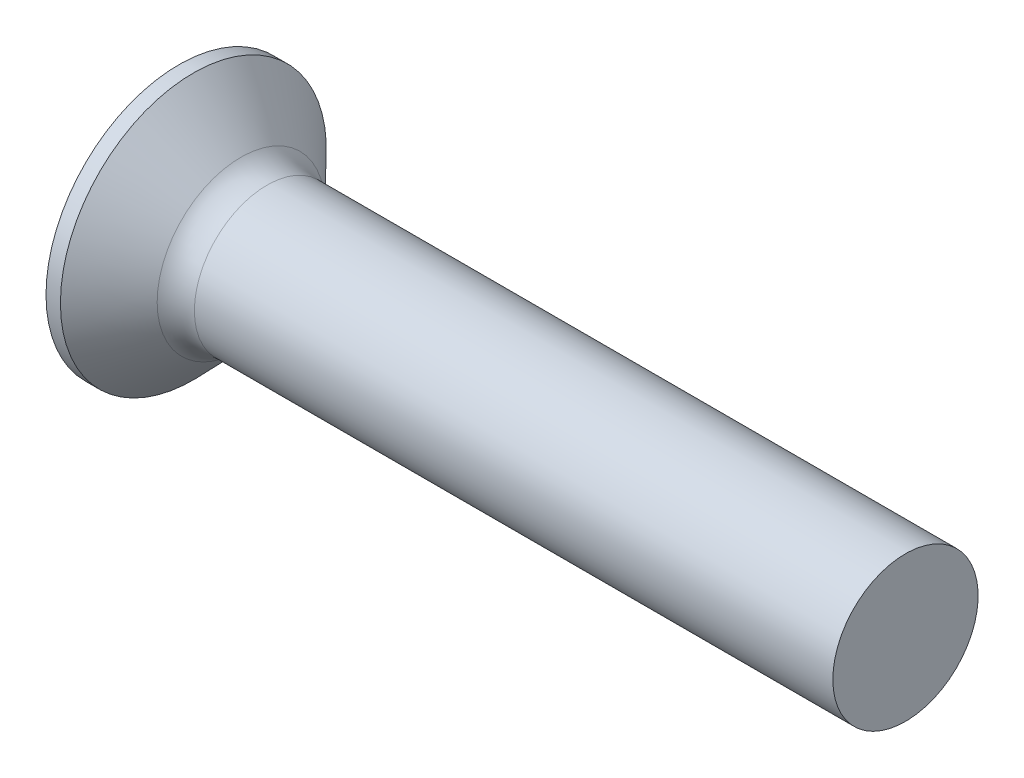
ISO-10303-21;
HEADER;
FILE_DESCRIPTION(('STEP AP214'),'2;1');
FILE_NAME('part.step','',(''),(''),'','','');
FILE_SCHEMA(('AUTOMOTIVE_DESIGN { 1 0 10303 214 1 1 1 1 }'));
ENDSEC;
DATA;
#1=APPLICATION_CONTEXT('core data for automotive mechanical design processes');
#2=APPLICATION_PROTOCOL_DEFINITION('international standard','automotive_design',2000,#1);
#3=PRODUCT_CONTEXT('',#1,'mechanical');
#4=PRODUCT('Part','Part','',(#3));
#5=PRODUCT_RELATED_PRODUCT_CATEGORY('part','',(#4));
#6=PRODUCT_DEFINITION_FORMATION('','',#4);
#7=PRODUCT_DEFINITION_CONTEXT('part definition',#1,'design');
#8=PRODUCT_DEFINITION('design','',#6,#7);
#9=PRODUCT_DEFINITION_SHAPE('','',#8);
#10=(LENGTH_UNIT() NAMED_UNIT(*) SI_UNIT(.MILLI.,.METRE.));
#11=(NAMED_UNIT(*) PLANE_ANGLE_UNIT() SI_UNIT($,.RADIAN.));
#12=(NAMED_UNIT(*) SI_UNIT($,.STERADIAN.) SOLID_ANGLE_UNIT());
#13=UNCERTAINTY_MEASURE_WITH_UNIT(LENGTH_MEASURE(1.E-05),#10,'distance_accuracy_value','');
#14=(GEOMETRIC_REPRESENTATION_CONTEXT(3) GLOBAL_UNCERTAINTY_ASSIGNED_CONTEXT((#13)) GLOBAL_UNIT_ASSIGNED_CONTEXT((#10,
#11,#12)) REPRESENTATION_CONTEXT('',''));
#15=CARTESIAN_POINT('',(0.,0.,0.));
#16=DIRECTION('',(0.,0.,1.));
#17=DIRECTION('',(1.,0.,0.));
#18=AXIS2_PLACEMENT_3D('',#15,#16,#17);
#19=CARTESIAN_POINT('',(5.64,-2.08800020083358,1.08));
#20=DIRECTION('',(0.,0.,-1.));
#21=DIRECTION('',(0.,1.,0.));
#22=AXIS2_PLACEMENT_3D('',#19,#20,#21);
#23=PLANE('',#22);
#24=DIRECTION('',(0.,-1.,0.));
#25=VECTOR('',#24,1.);
#26=CARTESIAN_POINT('',(0.,4.9,1.08));
#27=LINE('',#26,#25);
#28=CARTESIAN_POINT('',(0.,-2.05881047761803,1.08));
#29=VERTEX_POINT('',#28);
#30=CARTESIAN_POINT('',(0.,-4.9,1.08));
#31=VERTEX_POINT('',#30);
#32=EDGE_CURVE('E316',#29,#31,#27,.T.);
#33=ORIENTED_EDGE('',*,*,#32,.F.);
#34=CARTESIAN_POINT('',(-3.508552371452,-2.33231165002222,1.08));
#35=CARTESIAN_POINT('',(-2.8021242785535,-2.27786290347494,1.08));
#36=CARTESIAN_POINT('',(-2.09572000083794,-2.22310096882498,1.08));
#37=CARTESIAN_POINT('',(-0.682963739884883,-2.11273813340588,1.08));
#38=CARTESIAN_POINT('',(0.023388242128016,-2.05713721697088,1.08));
#39=CARTESIAN_POINT('',(1.08285390271521,-1.97294867301993,1.08));
#40=CARTESIAN_POINT('',(1.43599884659094,-1.94475462132179,1.08));
#41=CARTESIAN_POINT('',(2.14226366201043,-1.88806550876942,1.08));
#42=CARTESIAN_POINT('',(2.49538353361693,-1.8595704486972,1.08));
#43=CARTESIAN_POINT('',(3.2015889523463,-1.8022365024152,1.08));
#44=CARTESIAN_POINT('',(3.55467449997447,-1.77339762243347,1.08));
#45=CARTESIAN_POINT('',(4.26081605784269,-1.71532132056914,1.08));
#46=CARTESIAN_POINT('',(4.61387206778542,-1.68608389507013,1.08));
#47=CARTESIAN_POINT('',(5.41612732471709,-1.61911650604659,1.08));
#48=CARTESIAN_POINT('',(5.86531460668916,-1.58124295320442,1.08));
#49=CARTESIAN_POINT('',(6.76360881538388,-1.50456871786306,1.08));
#50=CARTESIAN_POINT('',(7.21271574234448,-1.46576803815681,1.08));
#51=CARTESIAN_POINT('',(8.11080846678724,-1.38699687421515,1.08));
#52=CARTESIAN_POINT('',(8.55979426851681,-1.34702643850978,1.08));
#53=CARTESIAN_POINT('',(9.45763439362018,-1.26556606443146,1.08));
#54=CARTESIAN_POINT('',(9.90648871523721,-1.22407610661242,1.08));
#55=CARTESIAN_POINT('',(10.804086472022,-1.13904091064148,1.08));
#56=CARTESIAN_POINT('',(11.2528298716191,-1.09549529593565,1.08));
#57=CARTESIAN_POINT('',(12.1500162616112,-1.00552937785306,1.08));
#58=CARTESIAN_POINT('',(12.5984592620319,-0.959109175798602,1.08));
#59=CARTESIAN_POINT('',(13.2708059653168,-0.8861578155995,1.08));
#60=CARTESIAN_POINT('',(13.4948891256712,-0.861284749868425,1.08));
#61=CARTESIAN_POINT('',(13.9428873803505,-0.810096676380915,1.08));
#62=CARTESIAN_POINT('',(14.1668024775431,-0.783781693824127,1.08));
#63=CARTESIAN_POINT('',(14.6144284155526,-0.729227223623335,1.08));
#64=CARTESIAN_POINT('',(14.8381392281789,-0.700987502036454,1.08));
#65=CARTESIAN_POINT('',(15.1734409779729,-0.656575769482208,1.08));
#66=CARTESIAN_POINT('',(15.2851674140663,-0.64142936052081,1.08));
#67=CARTESIAN_POINT('',(15.5085023247459,-0.610277030221323,1.08));
#68=CARTESIAN_POINT('',(15.6201107970542,-0.594271092583295,1.08));
#69=CARTESIAN_POINT('',(15.731644359719,-0.577747837441693,1.08));
#70=B_SPLINE_CURVE_WITH_KNOTS('',3,(#34,#35,#36,#37,#38,#39,#40,#41,#42,#43,#44,#45,#46,#47,#48,
#49,#50,#51,#52,#53,#54,#55,#56,#57,#58,#59,#60,#61,#62,#63,#64,#65,#66,#67,#68,#69),
.UNSPECIFIED.,.F.,.F.,(4,2,2,2,2,2,2,2,2,2,2,2,2,2,2,2,2,4),(0.,2.12557045381571,
4.25118064652266,5.31398639952898,6.37678939206669,7.4395731618212,8.50236658170693,
9.85470917308544,11.2070476910761,12.559330183477,13.9116299877686,15.2641784740572,
16.6166793133679,17.2930539423714,17.9694167544874,18.6458619223979,18.984104295463,
19.3223530851586),.UNSPECIFIED.);
#71=CARTESIAN_POINT('',(5.64,-1.60013444747621,1.08));
#72=VERTEX_POINT('',#71);
#73=EDGE_CURVE('E196',#29,#72,#70,.T.);
#74=ORIENTED_EDGE('',*,*,#73,.T.);
#75=DIRECTION('',(0.,-1.,0.));
#76=VECTOR('',#75,1.);
#77=CARTESIAN_POINT('',(5.64,2.08800020083358,1.08));
#78=LINE('',#77,#76);
#79=CARTESIAN_POINT('',(5.64,-2.08800020083358,1.08));
#80=VERTEX_POINT('',#79);
#81=EDGE_CURVE('E340',#72,#80,#78,.T.);
#82=ORIENTED_EDGE('',*,*,#81,.T.);
#83=DIRECTION('',(0.894934391398443,0.446197753347436,0.));
#84=VECTOR('',#83,1.);
#85=CARTESIAN_POINT('',(0.,-4.9,1.08));
#86=LINE('',#85,#84);
#87=EDGE_CURVE('E327',#31,#80,#86,.T.);
#88=ORIENTED_EDGE('',*,*,#87,.F.);
#89=EDGE_LOOP('',(#33,#74,#82,#88));
#90=FACE_BOUND('',#89,.T.);
#91=ADVANCED_FACE('F38',(#90),#23,.T.);
#92=CARTESIAN_POINT('',(5.64,2.08800020083359,1.08));
#93=VERTEX_POINT('',#92);
#94=CARTESIAN_POINT('',(5.64,1.60013444747621,1.08));
#95=VERTEX_POINT('',#94);
#96=EDGE_CURVE('E342',#93,#95,#78,.T.);
#97=ORIENTED_EDGE('',*,*,#96,.T.);
#98=CARTESIAN_POINT('',(-3.508552371452,2.33231165002222,1.08));
#99=CARTESIAN_POINT('',(-2.8021242785535,2.27786290347494,1.08));
#100=CARTESIAN_POINT('',(-2.09572000083793,2.22310096882498,1.08));
#101=CARTESIAN_POINT('',(-0.682963739884882,2.11273813340588,1.08));
#102=CARTESIAN_POINT('',(0.0233882421280164,2.05713721697088,1.08));
#103=CARTESIAN_POINT('',(1.08285390271521,1.97294867301993,1.08));
#104=CARTESIAN_POINT('',(1.43599884659094,1.94475462132179,1.08));
#105=CARTESIAN_POINT('',(2.14226366201043,1.88806550876942,1.08));
#106=CARTESIAN_POINT('',(2.49538353361693,1.8595704486972,1.08));
#107=CARTESIAN_POINT('',(3.2015889523463,1.8022365024152,1.08));
#108=CARTESIAN_POINT('',(3.55467449997447,1.77339762243347,1.08));
#109=CARTESIAN_POINT('',(4.26081605784269,1.71532132056914,1.08));
#110=CARTESIAN_POINT('',(4.61387206778542,1.68608389507013,1.08));
#111=CARTESIAN_POINT('',(5.41612732471709,1.61911650604659,1.08));
#112=CARTESIAN_POINT('',(5.86531460668916,1.58124295320442,1.08));
#113=CARTESIAN_POINT('',(6.76360881538388,1.50456871786306,1.08));
#114=CARTESIAN_POINT('',(7.21271574234448,1.46576803815681,1.08));
#115=CARTESIAN_POINT('',(8.11080846678724,1.38699687421515,1.08));
#116=CARTESIAN_POINT('',(8.55979426851681,1.34702643850978,1.08));
#117=CARTESIAN_POINT('',(9.45763439362018,1.26556606443146,1.08));
#118=CARTESIAN_POINT('',(9.90648871523721,1.22407610661242,1.08));
#119=CARTESIAN_POINT('',(10.804086472022,1.13904091064148,1.08));
#120=CARTESIAN_POINT('',(11.2528298716191,1.09549529593565,1.08));
#121=CARTESIAN_POINT('',(12.1500162616112,1.00552937785306,1.08));
#122=CARTESIAN_POINT('',(12.5984592620319,0.959109175798602,1.08));
#123=CARTESIAN_POINT('',(13.2708059653168,0.8861578155995,1.08));
#124=CARTESIAN_POINT('',(13.4948891256712,0.861284749868425,1.08));
#125=CARTESIAN_POINT('',(13.9428873803505,0.810096676380915,1.08));
#126=CARTESIAN_POINT('',(14.1668024775431,0.783781693824127,1.08));
#127=CARTESIAN_POINT('',(14.6144284155526,0.729227223623334,1.08));
#128=CARTESIAN_POINT('',(14.8381392281789,0.700987502036454,1.08));
#129=CARTESIAN_POINT('',(15.1734409779729,0.656575769482207,1.08));
#130=CARTESIAN_POINT('',(15.2851674140663,0.64142936052081,1.08));
#131=CARTESIAN_POINT('',(15.5085023247459,0.610277030221323,1.08));
#132=CARTESIAN_POINT('',(15.6201107970543,0.594271092583295,1.08));
#133=CARTESIAN_POINT('',(15.731644359719,0.577747837441693,1.08));
#134=B_SPLINE_CURVE_WITH_KNOTS('',3,(#98,#99,#100,#101,#102,#103,#104,#105,#106,#107,#108,#109,
#110,#111,#112,#113,#114,#115,#116,#117,#118,#119,#120,#121,#122,#123,#124,#125,#126,#127,#128,
#129,#130,#131,#132,#133),.UNSPECIFIED.,.F.,.F.,(4,2,2,2,2,2,2,2,2,2,2,2,2,2,2,2,2,4),(0.,
2.12557045381571,4.25118064652265,5.31398639952898,6.37678939206668,7.43957316182119,
8.50236658170693,9.85470917308544,11.2070476910761,12.559330183477,13.9116299877686,
15.2641784740572,16.6166793133679,17.2930539423714,17.9694167544874,18.6458619223979,
18.984104295463,19.3223530851586),.UNSPECIFIED.);
#135=CARTESIAN_POINT('',(0.,2.05881047761803,1.08));
#136=VERTEX_POINT('',#135);
#137=EDGE_CURVE('E189',#95,#136,#134,.F.);
#138=ORIENTED_EDGE('',*,*,#137,.T.);
#139=CARTESIAN_POINT('',(0.,4.9,1.08));
#140=VERTEX_POINT('',#139);
#141=EDGE_CURVE('E318',#140,#136,#27,.T.);
#142=ORIENTED_EDGE('',*,*,#141,.F.);
#143=DIRECTION('',(0.894934391398442,-0.446197753347436,0.));
#144=VECTOR('',#143,1.);
#145=CARTESIAN_POINT('',(0.,4.9,1.08));
#146=LINE('',#145,#144);
#147=EDGE_CURVE('E67',#140,#93,#146,.T.);
#148=ORIENTED_EDGE('',*,*,#147,.T.);
#149=EDGE_LOOP('',(#97,#138,#142,#148));
#150=FACE_BOUND('',#149,.T.);
#151=ADVANCED_FACE('F171',(#150),#23,.T.);
#152=CARTESIAN_POINT('',(5.64,2.08800020083359,-1.08));
#153=DIRECTION('',(0.,0.,1.));
#154=DIRECTION('',(0.,-1.,0.));
#155=AXIS2_PLACEMENT_3D('',#152,#153,#154);
#156=PLANE('',#155);
#157=DIRECTION('',(0.,1.,0.));
#158=VECTOR('',#157,1.);
#159=CARTESIAN_POINT('',(5.64,-2.08800020083359,-1.08));
#160=LINE('',#159,#158);
#161=CARTESIAN_POINT('',(5.64,-2.08800020083359,-1.08));
#162=VERTEX_POINT('',#161);
#163=CARTESIAN_POINT('',(5.64,-1.60013444747621,-1.08));
#164=VERTEX_POINT('',#163);
#165=EDGE_CURVE('E341',#162,#164,#160,.T.);
#166=ORIENTED_EDGE('',*,*,#165,.T.);
#167=CARTESIAN_POINT('',(-3.508552371452,-2.33231165002222,-1.08));
#168=CARTESIAN_POINT('',(-2.8021242785535,-2.27786290347494,-1.08));
#169=CARTESIAN_POINT('',(-2.09572000083793,-2.22310096882498,-1.08));
#170=CARTESIAN_POINT('',(-0.682963739884882,-2.11273813340588,-1.08));
#171=CARTESIAN_POINT('',(0.0233882421280164,-2.05713721697088,-1.08));
#172=CARTESIAN_POINT('',(1.08285390271521,-1.97294867301993,-1.08));
#173=CARTESIAN_POINT('',(1.43599884659094,-1.94475462132179,-1.08));
#174=CARTESIAN_POINT('',(2.14226366201043,-1.88806550876942,-1.08));
#175=CARTESIAN_POINT('',(2.49538353361693,-1.8595704486972,-1.08));
#176=CARTESIAN_POINT('',(3.2015889523463,-1.8022365024152,-1.08));
#177=CARTESIAN_POINT('',(3.55467449997447,-1.77339762243347,-1.08));
#178=CARTESIAN_POINT('',(4.26081605784269,-1.71532132056914,-1.08));
#179=CARTESIAN_POINT('',(4.61387206778542,-1.68608389507013,-1.08));
#180=CARTESIAN_POINT('',(5.41612732471709,-1.61911650604659,-1.08));
#181=CARTESIAN_POINT('',(5.86531460668916,-1.58124295320442,-1.08));
#182=CARTESIAN_POINT('',(6.76360881538388,-1.50456871786306,-1.08));
#183=CARTESIAN_POINT('',(7.21271574234448,-1.46576803815681,-1.08));
#184=CARTESIAN_POINT('',(8.11080846678724,-1.38699687421515,-1.08));
#185=CARTESIAN_POINT('',(8.55979426851681,-1.34702643850978,-1.08));
#186=CARTESIAN_POINT('',(9.45763439362018,-1.26556606443146,-1.08));
#187=CARTESIAN_POINT('',(9.90648871523721,-1.22407610661242,-1.08));
#188=CARTESIAN_POINT('',(10.804086472022,-1.13904091064148,-1.08));
#189=CARTESIAN_POINT('',(11.2528298716191,-1.09549529593565,-1.08));
#190=CARTESIAN_POINT('',(12.1500162616112,-1.00552937785306,-1.08));
#191=CARTESIAN_POINT('',(12.5984592620319,-0.959109175798602,-1.08));
#192=CARTESIAN_POINT('',(13.2708059653168,-0.8861578155995,-1.08));
#193=CARTESIAN_POINT('',(13.4948891256712,-0.861284749868425,-1.08));
#194=CARTESIAN_POINT('',(13.9428873803505,-0.810096676380915,-1.08));
#195=CARTESIAN_POINT('',(14.1668024775431,-0.783781693824127,-1.08));
#196=CARTESIAN_POINT('',(14.6144284155526,-0.729227223623334,-1.08));
#197=CARTESIAN_POINT('',(14.8381392281789,-0.700987502036453,-1.08));
#198=CARTESIAN_POINT('',(15.1734409779729,-0.656575769482206,-1.08));
#199=CARTESIAN_POINT('',(15.2851674140663,-0.641429360520809,-1.08));
#200=CARTESIAN_POINT('',(15.5085023247459,-0.610277030221322,-1.08));
#201=CARTESIAN_POINT('',(15.6201107970543,-0.594271092583294,-1.08));
#202=CARTESIAN_POINT('',(15.731644359719,-0.577747837441693,-1.08));
#203=B_SPLINE_CURVE_WITH_KNOTS('',3,(#167,#168,#169,#170,#171,#172,#173,#174,#175,#176,#177,
#178,#179,#180,#181,#182,#183,#184,#185,#186,#187,#188,#189,#190,#191,#192,#193,#194,#195,#196,
#197,#198,#199,#200,#201,#202),.UNSPECIFIED.,.F.,.F.,(4,2,2,2,2,2,2,2,2,2,2,2,2,2,2,2,2,4),(0.,
2.12557045381571,4.25118064652265,5.31398639952898,6.37678939206668,7.43957316182119,
8.50236658170693,9.85470917308544,11.2070476910761,12.559330183477,13.9116299877686,
15.2641784740572,16.6166793133679,17.2930539423714,17.9694167544874,18.6458619223979,
18.984104295463,19.3223530851586),.UNSPECIFIED.);
#204=CARTESIAN_POINT('',(0.,-2.05881047761803,-1.08));
#205=VERTEX_POINT('',#204);
#206=EDGE_CURVE('E242',#164,#205,#203,.F.);
#207=ORIENTED_EDGE('',*,*,#206,.T.);
#208=DIRECTION('',(0.,1.,0.));
#209=VECTOR('',#208,1.);
#210=CARTESIAN_POINT('',(0.,-4.9,-1.08));
#211=LINE('',#210,#209);
#212=CARTESIAN_POINT('',(0.,-4.9,-1.08));
#213=VERTEX_POINT('',#212);
#214=EDGE_CURVE('E317',#213,#205,#211,.T.);
#215=ORIENTED_EDGE('',*,*,#214,.F.);
#216=DIRECTION('',(0.894934391398443,0.446197753347436,0.));
#217=VECTOR('',#216,1.);
#218=CARTESIAN_POINT('',(0.,-4.9,-1.08));
#219=LINE('',#218,#217);
#220=EDGE_CURVE('E330',#213,#162,#219,.T.);
#221=ORIENTED_EDGE('',*,*,#220,.T.);
#222=EDGE_LOOP('',(#166,#207,#215,#221));
#223=FACE_BOUND('',#222,.T.);
#224=ADVANCED_FACE('F177',(#223),#156,.T.);
#225=CARTESIAN_POINT('',(0.,2.05881047761803,-1.08));
#226=VERTEX_POINT('',#225);
#227=CARTESIAN_POINT('',(0.,4.9,-1.08));
#228=VERTEX_POINT('',#227);
#229=EDGE_CURVE('E326',#226,#228,#211,.T.);
#230=ORIENTED_EDGE('',*,*,#229,.F.);
#231=CARTESIAN_POINT('',(-3.508552371452,2.33231165002222,-1.08));
#232=CARTESIAN_POINT('',(-2.8021242785535,2.27786290347494,-1.08));
#233=CARTESIAN_POINT('',(-2.09572000083794,2.22310096882498,-1.08));
#234=CARTESIAN_POINT('',(-0.682963739884883,2.11273813340588,-1.08));
#235=CARTESIAN_POINT('',(0.023388242128016,2.05713721697088,-1.08));
#236=CARTESIAN_POINT('',(1.08285390271521,1.97294867301993,-1.08));
#237=CARTESIAN_POINT('',(1.43599884659094,1.94475462132179,-1.08));
#238=CARTESIAN_POINT('',(2.14226366201043,1.88806550876942,-1.08));
#239=CARTESIAN_POINT('',(2.49538353361693,1.8595704486972,-1.08));
#240=CARTESIAN_POINT('',(3.2015889523463,1.8022365024152,-1.08));
#241=CARTESIAN_POINT('',(3.55467449997447,1.77339762243347,-1.08));
#242=CARTESIAN_POINT('',(4.26081605784269,1.71532132056914,-1.08));
#243=CARTESIAN_POINT('',(4.61387206778542,1.68608389507013,-1.08));
#244=CARTESIAN_POINT('',(5.41612732471709,1.61911650604659,-1.08));
#245=CARTESIAN_POINT('',(5.86531460668916,1.58124295320442,-1.08));
#246=CARTESIAN_POINT('',(6.76360881538388,1.50456871786306,-1.08));
#247=CARTESIAN_POINT('',(7.21271574234448,1.46576803815681,-1.08));
#248=CARTESIAN_POINT('',(8.11080846678724,1.38699687421515,-1.08));
#249=CARTESIAN_POINT('',(8.55979426851681,1.34702643850978,-1.08));
#250=CARTESIAN_POINT('',(9.45763439362018,1.26556606443146,-1.08));
#251=CARTESIAN_POINT('',(9.90648871523721,1.22407610661242,-1.08));
#252=CARTESIAN_POINT('',(10.804086472022,1.13904091064148,-1.08));
#253=CARTESIAN_POINT('',(11.2528298716191,1.09549529593565,-1.08));
#254=CARTESIAN_POINT('',(12.1500162616112,1.00552937785306,-1.08));
#255=CARTESIAN_POINT('',(12.5984592620319,0.959109175798602,-1.08));
#256=CARTESIAN_POINT('',(13.2708059653168,0.8861578155995,-1.08));
#257=CARTESIAN_POINT('',(13.4948891256712,0.861284749868425,-1.08));
#258=CARTESIAN_POINT('',(13.9428873803505,0.810096676380915,-1.08));
#259=CARTESIAN_POINT('',(14.1668024775431,0.783781693824127,-1.08));
#260=CARTESIAN_POINT('',(14.6144284155526,0.729227223623335,-1.08));
#261=CARTESIAN_POINT('',(14.8381392281789,0.700987502036455,-1.08));
#262=CARTESIAN_POINT('',(15.1734409779729,0.656575769482208,-1.08));
#263=CARTESIAN_POINT('',(15.2851674140663,0.641429360520811,-1.08));
#264=CARTESIAN_POINT('',(15.5085023247459,0.610277030221324,-1.08));
#265=CARTESIAN_POINT('',(15.6201107970542,0.594271092583296,-1.08));
#266=CARTESIAN_POINT('',(15.731644359719,0.577747837441694,-1.08));
#267=B_SPLINE_CURVE_WITH_KNOTS('',3,(#231,#232,#233,#234,#235,#236,#237,#238,#239,#240,#241,
#242,#243,#244,#245,#246,#247,#248,#249,#250,#251,#252,#253,#254,#255,#256,#257,#258,#259,#260,
#261,#262,#263,#264,#265,#266),.UNSPECIFIED.,.F.,.F.,(4,2,2,2,2,2,2,2,2,2,2,2,2,2,2,2,2,4),(0.,
2.12557045381571,4.25118064652266,5.31398639952898,6.37678939206669,7.4395731618212,
8.50236658170693,9.85470917308544,11.2070476910761,12.559330183477,13.9116299877686,
15.2641784740572,16.6166793133679,17.2930539423714,17.9694167544874,18.6458619223979,
18.984104295463,19.3223530851586),.UNSPECIFIED.);
#268=CARTESIAN_POINT('',(5.64,1.60013444747621,-1.08));
#269=VERTEX_POINT('',#268);
#270=EDGE_CURVE('E237',#226,#269,#267,.T.);
#271=ORIENTED_EDGE('',*,*,#270,.T.);
#272=CARTESIAN_POINT('',(5.64,2.08800020083358,-1.08));
#273=VERTEX_POINT('',#272);
#274=EDGE_CURVE('E347',#269,#273,#160,.T.);
#275=ORIENTED_EDGE('',*,*,#274,.T.);
#276=DIRECTION('',(0.894934391398443,-0.446197753347436,0.));
#277=VECTOR('',#276,1.);
#278=CARTESIAN_POINT('',(0.,4.9,-1.08));
#279=LINE('',#278,#277);
#280=EDGE_CURVE('E334',#228,#273,#279,.T.);
#281=ORIENTED_EDGE('',*,*,#280,.F.);
#282=EDGE_LOOP('',(#230,#271,#275,#281));
#283=FACE_BOUND('',#282,.T.);
#284=ADVANCED_FACE('F463',(#283),#156,.T.);
#285=CARTESIAN_POINT('',(5.64,2.08800020083358,-1.08));
#286=DIRECTION('',(1.,0.,0.));
#287=DIRECTION('',(0.,0.,-1.));
#288=AXIS2_PLACEMENT_3D('',#285,#286,#287);
#289=PLANE('',#288);
#290=CARTESIAN_POINT('',(5.64,0.,0.));
#291=DIRECTION('',(-1.,0.,0.));
#292=DIRECTION('',(0.,0.,1.));
#293=AXIS2_PLACEMENT_3D('',#290,#291,#292);
#294=CIRCLE('',#293,1.9305);
#295=EDGE_CURVE('E286',#164,#72,#294,.T.);
#296=ORIENTED_EDGE('',*,*,#295,.F.);
#297=ORIENTED_EDGE('',*,*,#165,.F.);
#298=DIRECTION('',(0.,0.,-1.));
#299=VECTOR('',#298,1.);
#300=CARTESIAN_POINT('',(5.64,-2.08800020083358,1.08));
#301=LINE('',#300,#299);
#302=EDGE_CURVE('E337',#80,#162,#301,.T.);
#303=ORIENTED_EDGE('',*,*,#302,.F.);
#304=ORIENTED_EDGE('',*,*,#81,.F.);
#305=EDGE_LOOP('',(#296,#297,#303,#304));
#306=FACE_BOUND('',#305,.T.);
#307=ADVANCED_FACE('F420',(#306),#289,.F.);
#308=CARTESIAN_POINT('',(5.64,-1.08000000000001,1.60013444747621));
#309=VERTEX_POINT('',#308);
#310=CARTESIAN_POINT('',(5.64,1.07999999999999,1.60013444747622));
#311=VERTEX_POINT('',#310);
#312=EDGE_CURVE('E279',#309,#311,#294,.T.);
#313=ORIENTED_EDGE('',*,*,#312,.F.);
#314=DIRECTION('',(0.,0.,-1.));
#315=VECTOR('',#314,1.);
#316=CARTESIAN_POINT('',(5.64,-1.08000000000001,2.08800020083358));
#317=LINE('',#316,#315);
#318=CARTESIAN_POINT('',(5.64,-1.08000000000001,2.08800020083358));
#319=VERTEX_POINT('',#318);
#320=EDGE_CURVE('E405',#319,#309,#317,.T.);
#321=ORIENTED_EDGE('',*,*,#320,.F.);
#322=DIRECTION('',(0.,-1.,0.));
#323=VECTOR('',#322,1.);
#324=CARTESIAN_POINT('',(5.64,1.07999999999999,2.08800020083359));
#325=LINE('',#324,#323);
#326=CARTESIAN_POINT('',(5.64,1.07999999999999,2.08800020083359));
#327=VERTEX_POINT('',#326);
#328=EDGE_CURVE('E305',#327,#319,#325,.T.);
#329=ORIENTED_EDGE('',*,*,#328,.F.);
#330=DIRECTION('',(0.,0.,1.));
#331=VECTOR('',#330,1.);
#332=CARTESIAN_POINT('',(5.64,1.08000000000001,-2.08800020083358));
#333=LINE('',#332,#331);
#334=EDGE_CURVE('E203',#311,#327,#333,.T.);
#335=ORIENTED_EDGE('',*,*,#334,.F.);
#336=EDGE_LOOP('',(#313,#321,#329,#335));
#337=FACE_BOUND('',#336,.T.);
#338=ADVANCED_FACE('F455',(#337),#289,.F.);
#339=EDGE_CURVE('E278',#95,#269,#294,.T.);
#340=ORIENTED_EDGE('',*,*,#339,.F.);
#341=ORIENTED_EDGE('',*,*,#96,.F.);
#342=DIRECTION('',(0.,0.,1.));
#343=VECTOR('',#342,1.);
#344=CARTESIAN_POINT('',(5.64,2.08800020083358,-1.08));
#345=LINE('',#344,#343);
#346=EDGE_CURVE('E338',#273,#93,#345,.T.);
#347=ORIENTED_EDGE('',*,*,#346,.F.);
#348=ORIENTED_EDGE('',*,*,#274,.F.);
#349=EDGE_LOOP('',(#340,#341,#347,#348));
#350=FACE_BOUND('',#349,.T.);
#351=ADVANCED_FACE('F435',(#350),#289,.F.);
#352=CARTESIAN_POINT('',(5.64,1.07999999999999,2.08800020083359));
#353=DIRECTION('',(0.,-1.,0.));
#354=DIRECTION('',(0.,0.,-1.));
#355=AXIS2_PLACEMENT_3D('',#352,#353,#354);
#356=PLANE('',#355);
#357=CARTESIAN_POINT('',(5.64,1.08000000000001,-2.08800020083358));
#358=VERTEX_POINT('',#357);
#359=CARTESIAN_POINT('',(5.64,1.08000000000001,-1.60013444747621));
#360=VERTEX_POINT('',#359);
#361=EDGE_CURVE('E300',#358,#360,#333,.T.);
#362=ORIENTED_EDGE('',*,*,#361,.T.);
#363=CARTESIAN_POINT('',(-3.508552371452,1.08000000000001,-2.33231165002222));
#364=CARTESIAN_POINT('',(-2.8021242785535,1.08000000000001,-2.27786290347493));
#365=CARTESIAN_POINT('',(-2.09572000083793,1.08000000000001,-2.22310096882497));
#366=CARTESIAN_POINT('',(-0.682963739884882,1.08000000000001,-2.11273813340588));
#367=CARTESIAN_POINT('',(0.0233882421280166,1.08000000000001,-2.05713721697088));
#368=CARTESIAN_POINT('',(1.08285390271521,1.08000000000001,-1.97294867301992));
#369=CARTESIAN_POINT('',(1.43599884659094,1.08000000000001,-1.94475462132178));
#370=CARTESIAN_POINT('',(2.14226366201043,1.08000000000001,-1.88806550876941));
#371=CARTESIAN_POINT('',(2.49538353361693,1.08000000000001,-1.8595704486972));
#372=CARTESIAN_POINT('',(3.2015889523463,1.08000000000001,-1.8022365024152));
#373=CARTESIAN_POINT('',(3.55467449997447,1.08000000000001,-1.77339762243347));
#374=CARTESIAN_POINT('',(4.26081605784269,1.08000000000001,-1.71532132056914));
#375=CARTESIAN_POINT('',(4.61387206778542,1.08000000000001,-1.68608389507012));
#376=CARTESIAN_POINT('',(5.41612732471709,1.08000000000001,-1.61911650604659));
#377=CARTESIAN_POINT('',(5.86531460668917,1.08000000000001,-1.58124295320442));
#378=CARTESIAN_POINT('',(6.76360881538388,1.08000000000001,-1.50456871786305));
#379=CARTESIAN_POINT('',(7.21271574234448,1.08000000000001,-1.46576803815681));
#380=CARTESIAN_POINT('',(8.11080846678724,1.08,-1.38699687421514));
#381=CARTESIAN_POINT('',(8.55979426851682,1.08,-1.34702643850977));
#382=CARTESIAN_POINT('',(9.45763439362019,1.08,-1.26556606443145));
#383=CARTESIAN_POINT('',(9.90648871523721,1.08,-1.22407610661242));
#384=CARTESIAN_POINT('',(10.804086472022,1.08,-1.13904091064148));
#385=CARTESIAN_POINT('',(11.2528298716191,1.08,-1.09549529593564));
#386=CARTESIAN_POINT('',(12.1500162616112,1.08,-1.00552937785305));
#387=CARTESIAN_POINT('',(12.5984592620319,1.08,-0.959109175798598));
#388=CARTESIAN_POINT('',(13.2708059653168,1.08,-0.886157815599496));
#389=CARTESIAN_POINT('',(13.4948891256712,1.08,-0.861284749868421));
#390=CARTESIAN_POINT('',(13.9428873803505,1.08,-0.810096676380911));
#391=CARTESIAN_POINT('',(14.1668024775431,1.08,-0.783781693824123));
#392=CARTESIAN_POINT('',(14.6144284155526,1.08,-0.729227223623331));
#393=CARTESIAN_POINT('',(14.8381392281789,1.08,-0.70098750203645));
#394=CARTESIAN_POINT('',(15.1734409779729,1.08,-0.656575769482203));
#395=CARTESIAN_POINT('',(15.2851674140663,1.08,-0.641429360520806));
#396=CARTESIAN_POINT('',(15.5085023247459,1.08,-0.610277030221319));
#397=CARTESIAN_POINT('',(15.6201107970542,1.08,-0.594271092583291));
#398=CARTESIAN_POINT('',(15.731644359719,1.08,-0.577747837441689));
#399=B_SPLINE_CURVE_WITH_KNOTS('',3,(#363,#364,#365,#366,#367,#368,#369,#370,#371,#372,#373,
#374,#375,#376,#377,#378,#379,#380,#381,#382,#383,#384,#385,#386,#387,#388,#389,#390,#391,#392,
#393,#394,#395,#396,#397,#398),.UNSPECIFIED.,.F.,.F.,(4,2,2,2,2,2,2,2,2,2,2,2,2,2,2,2,2,4),(0.,
2.12557045381571,4.25118064652265,5.31398639952898,6.37678939206668,7.43957316182119,
8.50236658170693,9.85470917308545,11.2070476910761,12.559330183477,13.9116299877686,
15.2641784740572,16.6166793133679,17.2930539423714,17.9694167544874,18.6458619223979,
18.984104295463,19.3223530851586),.UNSPECIFIED.);
#400=CARTESIAN_POINT('',(0.,1.08000000000001,-2.05881047761803));
#401=VERTEX_POINT('',#400);
#402=EDGE_CURVE('E230',#360,#401,#399,.F.);
#403=ORIENTED_EDGE('',*,*,#402,.T.);
#404=DIRECTION('',(0.,0.,1.));
#405=VECTOR('',#404,1.);
#406=CARTESIAN_POINT('',(0.,1.08000000000002,-4.9));
#407=LINE('',#406,#405);
#408=CARTESIAN_POINT('',(0.,1.08000000000002,-4.9));
#409=VERTEX_POINT('',#408);
#410=EDGE_CURVE('E394',#409,#401,#407,.T.);
#411=ORIENTED_EDGE('',*,*,#410,.F.);
#412=DIRECTION('',(0.894934391398443,0.,0.446197753347436));
#413=VECTOR('',#412,1.);
#414=CARTESIAN_POINT('',(0.,1.08000000000002,-4.9));
#415=LINE('',#414,#413);
#416=EDGE_CURVE('E304',#409,#358,#415,.T.);
#417=ORIENTED_EDGE('',*,*,#416,.T.);
#418=EDGE_LOOP('',(#362,#403,#411,#417));
#419=FACE_BOUND('',#418,.T.);
#420=ADVANCED_FACE('F303',(#419),#356,.T.);
#421=CARTESIAN_POINT('',(5.64,-1.07999999999999,-2.08800020083359));
#422=DIRECTION('',(0.,1.,0.));
#423=DIRECTION('',(0.,0.,1.));
#424=AXIS2_PLACEMENT_3D('',#421,#422,#423);
#425=PLANE('',#424);
#426=DIRECTION('',(0.,0.,-1.));
#427=VECTOR('',#426,1.);
#428=CARTESIAN_POINT('',(0.,-1.08000000000002,4.9));
#429=LINE('',#428,#427);
#430=CARTESIAN_POINT('',(0.,-1.07999999999999,-2.05881047761803));
#431=VERTEX_POINT('',#430);
#432=CARTESIAN_POINT('',(0.,-1.07999999999998,-4.9));
#433=VERTEX_POINT('',#432);
#434=EDGE_CURVE('E390',#431,#433,#429,.T.);
#435=ORIENTED_EDGE('',*,*,#434,.F.);
#436=CARTESIAN_POINT('',(-3.50855235785895,-1.07999999999999,-2.33231164897475));
#437=CARTESIAN_POINT('',(-2.80212426669874,-1.07999999999999,-2.27786290255719));
#438=CARTESIAN_POINT('',(-2.09571999072138,-1.07999999999999,-2.22310096803798));
#439=CARTESIAN_POINT('',(-0.682963733244686,-1.07999999999999,-2.11273813288379));
#440=CARTESIAN_POINT('',(0.0233882470300694,-1.07999999999999,-2.05713721658294));
#441=CARTESIAN_POINT('',(1.0828539044558,-1.07999999999999,-1.97294867288083));
#442=CARTESIAN_POINT('',(1.43599884690811,-1.07999999999999,-1.94475462129602));
#443=CARTESIAN_POINT('',(2.14226365948097,-1.07999999999999,-1.88806550897277));
#444=CARTESIAN_POINT('',(2.49538352966426,-1.07999999999999,-1.85957044901634));
#445=CARTESIAN_POINT('',(3.20158894554756,-1.07999999999999,-1.80223650296893));
#446=CARTESIAN_POINT('',(3.55467449175288,-1.07999999999999,-1.773397623106));
#447=CARTESIAN_POINT('',(4.26081604677565,-1.07999999999999,-1.715321321483));
#448=CARTESIAN_POINT('',(4.61387205529579,-1.07999999999999,-1.68608389610653));
#449=CARTESIAN_POINT('',(5.41612731080518,-1.07999999999999,-1.61911650721573));
#450=CARTESIAN_POINT('',(5.86531459277744,-1.07999999999999,-1.58124295438217));
#451=CARTESIAN_POINT('',(6.76360880147275,-1.07999999999999,-1.50456871906016));
#452=CARTESIAN_POINT('',(7.21271572843376,-1.08,-1.46576803936464));
#453=CARTESIAN_POINT('',(8.11080845287784,-1.08,-1.38699687544742));
#454=CARTESIAN_POINT('',(8.55979425460832,-1.08,-1.34702643975574));
#455=CARTESIAN_POINT('',(9.45763437971387,-1.08,-1.26556606570916));
#456=CARTESIAN_POINT('',(9.90648870133217,-1.08,-1.22407610790817));
#457=CARTESIAN_POINT('',(10.8040864581195,-1.08,-1.13904091198014));
#458=CARTESIAN_POINT('',(11.2528298577178,-1.08,-1.09549529729918));
#459=CARTESIAN_POINT('',(12.1500162477138,-1.08,-1.00552937927742));
#460=CARTESIAN_POINT('',(12.5984592481373,-1.08,-0.959109177258921));
#461=CARTESIAN_POINT('',(13.2708059514278,-1.08,-0.886157817129854));
#462=CARTESIAN_POINT('',(13.4948891117843,-1.08,-0.861284751424839));
#463=CARTESIAN_POINT('',(13.9428873664685,-1.08,-0.810096677997516));
#464=CARTESIAN_POINT('',(14.1668024636642,-1.08,-0.783781695474855));
#465=CARTESIAN_POINT('',(14.6144284016815,-1.08,-0.729227225354877));
#466=CARTESIAN_POINT('',(14.8381392143124,-1.08,-0.700987503814688));
#467=CARTESIAN_POINT('',(15.1734409641157,-1.08,-0.656575771346784));
#468=CARTESIAN_POINT('',(15.2851674002126,-1.08,-0.641429362416894));
#469=CARTESIAN_POINT('',(15.5085023109006,-1.08,-0.610277032188302));
#470=CARTESIAN_POINT('',(15.6201107832138,-1.08,-0.594271094589663));
#471=CARTESIAN_POINT('',(15.7316443458843,-1.08,-0.577747839492609));
#472=B_SPLINE_CURVE_WITH_KNOTS('',3,(#436,#437,#438,#439,#440,#441,#442,#443,#444,#445,#446,
#447,#448,#449,#450,#451,#452,#453,#454,#455,#456,#457,#458,#459,#460,#461,#462,#463,#464,#465,
#466,#467,#468,#469,#470,#471),.UNSPECIFIED.,.F.,.F.,(4,2,2,2,2,2,2,2,2,2,2,2,2,2,2,2,2,4),(0.,
2.12557044858637,4.25118063606338,5.31398638478592,6.3767893730399,7.439573138511,
8.50236655411318,9.85470914549009,11.2070476634792,12.5593301558792,13.9116299601696,
15.2641784464547,16.6166792857626,17.2930539147632,17.9694167268767,18.6458618947834,
18.9841042678463,19.3223530575396),.UNSPECIFIED.);
#473=CARTESIAN_POINT('',(5.64,-1.07999999999999,-1.60013444747621));
#474=VERTEX_POINT('',#473);
#475=EDGE_CURVE('E223',#431,#474,#472,.T.);
#476=ORIENTED_EDGE('',*,*,#475,.T.);
#477=CARTESIAN_POINT('',(5.64,-1.07999999999999,-2.08800020083359));
#478=VERTEX_POINT('',#477);
#479=EDGE_CURVE('E302',#474,#478,#317,.T.);
#480=ORIENTED_EDGE('',*,*,#479,.T.);
#481=DIRECTION('',(0.894934391398443,0.,0.446197753347436));
#482=VECTOR('',#481,1.);
#483=CARTESIAN_POINT('',(0.,-1.07999999999998,-4.9));
#484=LINE('',#483,#482);
#485=EDGE_CURVE('E397',#433,#478,#484,.T.);
#486=ORIENTED_EDGE('',*,*,#485,.F.);
#487=EDGE_LOOP('',(#435,#476,#480,#486));
#488=FACE_BOUND('',#487,.T.);
#489=ADVANCED_FACE('F408',(#488),#425,.T.);
#490=ORIENTED_EDGE('',*,*,#320,.T.);
#491=CARTESIAN_POINT('',(-3.508552371452,-1.08000000000001,2.33231165002222));
#492=CARTESIAN_POINT('',(-2.8021242785535,-1.08000000000001,2.27786290347493));
#493=CARTESIAN_POINT('',(-2.09572000083794,-1.08000000000001,2.22310096882497));
#494=CARTESIAN_POINT('',(-0.682963739884883,-1.08000000000001,2.11273813340588));
#495=CARTESIAN_POINT('',(0.023388242128016,-1.08000000000001,2.05713721697088));
#496=CARTESIAN_POINT('',(1.08285390271521,-1.08000000000001,1.97294867301992));
#497=CARTESIAN_POINT('',(1.43599884659094,-1.08000000000001,1.94475462132178));
#498=CARTESIAN_POINT('',(2.14226366201044,-1.08000000000001,1.88806550876941));
#499=CARTESIAN_POINT('',(2.49538353361694,-1.08000000000001,1.8595704486972));
#500=CARTESIAN_POINT('',(3.2015889523463,-1.08000000000001,1.8022365024152));
#501=CARTESIAN_POINT('',(3.55467449997447,-1.08000000000001,1.77339762243347));
#502=CARTESIAN_POINT('',(4.26081605784269,-1.08000000000001,1.71532132056914));
#503=CARTESIAN_POINT('',(4.61387206778542,-1.08000000000001,1.68608389507012));
#504=CARTESIAN_POINT('',(5.41612732471709,-1.08000000000001,1.61911650604659));
#505=CARTESIAN_POINT('',(5.86531460668917,-1.08000000000001,1.58124295320442));
#506=CARTESIAN_POINT('',(6.76360881538388,-1.08000000000001,1.50456871786305));
#507=CARTESIAN_POINT('',(7.21271574234448,-1.08000000000001,1.46576803815681));
#508=CARTESIAN_POINT('',(8.11080846678724,-1.08,1.38699687421514));
#509=CARTESIAN_POINT('',(8.55979426851682,-1.08,1.34702643850977));
#510=CARTESIAN_POINT('',(9.45763439362018,-1.08,1.26556606443145));
#511=CARTESIAN_POINT('',(9.90648871523721,-1.08,1.22407610661242));
#512=CARTESIAN_POINT('',(10.804086472022,-1.08,1.13904091064148));
#513=CARTESIAN_POINT('',(11.2528298716191,-1.08,1.09549529593564));
#514=CARTESIAN_POINT('',(12.1500162616112,-1.08,1.00552937785305));
#515=CARTESIAN_POINT('',(12.5984592620319,-1.08,0.959109175798599));
#516=CARTESIAN_POINT('',(13.2708059653168,-1.08,0.886157815599496));
#517=CARTESIAN_POINT('',(13.4948891256712,-1.08,0.861284749868421));
#518=CARTESIAN_POINT('',(13.9428873803505,-1.08,0.810096676380912));
#519=CARTESIAN_POINT('',(14.1668024775431,-1.08,0.783781693824123));
#520=CARTESIAN_POINT('',(14.6144284155526,-1.08,0.729227223623332));
#521=CARTESIAN_POINT('',(14.8381392281789,-1.08,0.700987502036451));
#522=CARTESIAN_POINT('',(15.1734409779729,-1.08,0.656575769482204));
#523=CARTESIAN_POINT('',(15.2851674140663,-1.08,0.641429360520807));
#524=CARTESIAN_POINT('',(15.5085023247459,-1.08,0.61027703022132));
#525=CARTESIAN_POINT('',(15.6201107970542,-1.08,0.594271092583292));
#526=CARTESIAN_POINT('',(15.731644359719,-1.08,0.57774783744169));
#527=B_SPLINE_CURVE_WITH_KNOTS('',3,(#491,#492,#493,#494,#495,#496,#497,#498,#499,#500,#501,
#502,#503,#504,#505,#506,#507,#508,#509,#510,#511,#512,#513,#514,#515,#516,#517,#518,#519,#520,
#521,#522,#523,#524,#525,#526),.UNSPECIFIED.,.F.,.F.,(4,2,2,2,2,2,2,2,2,2,2,2,2,2,2,2,2,4),(0.,
2.12557045381571,4.25118064652266,5.31398639952898,6.37678939206669,7.4395731618212,
8.50236658170693,9.85470917308545,11.2070476910761,12.559330183477,13.9116299877686,
15.2641784740572,16.6166793133679,17.2930539423714,17.9694167544874,18.6458619223979,
18.984104295463,19.3223530851586),.UNSPECIFIED.);
#528=CARTESIAN_POINT('',(0.,-1.08000000000001,2.05881047761803));
#529=VERTEX_POINT('',#528);
#530=EDGE_CURVE('E215',#309,#529,#527,.F.);
#531=ORIENTED_EDGE('',*,*,#530,.T.);
#532=CARTESIAN_POINT('',(0.,-1.08000000000002,4.9));
#533=VERTEX_POINT('',#532);
#534=EDGE_CURVE('E386',#533,#529,#429,.T.);
#535=ORIENTED_EDGE('',*,*,#534,.F.);
#536=DIRECTION('',(0.894934391398442,0.,-0.446197753347436));
#537=VECTOR('',#536,1.);
#538=CARTESIAN_POINT('',(0.,-1.08000000000002,4.9));
#539=LINE('',#538,#537);
#540=EDGE_CURVE('E401',#533,#319,#539,.T.);
#541=ORIENTED_EDGE('',*,*,#540,.T.);
#542=EDGE_LOOP('',(#490,#531,#535,#541));
#543=FACE_BOUND('',#542,.T.);
#544=ADVANCED_FACE('F439',(#543),#425,.T.);
#545=CARTESIAN_POINT('',(0.,1.07999999999999,2.05881047761803));
#546=VERTEX_POINT('',#545);
#547=CARTESIAN_POINT('',(0.,1.07999999999998,4.9));
#548=VERTEX_POINT('',#547);
#549=EDGE_CURVE('E396',#546,#548,#407,.T.);
#550=ORIENTED_EDGE('',*,*,#549,.F.);
#551=CARTESIAN_POINT('',(-3.50855235785895,1.07999999999999,2.33231164897475));
#552=CARTESIAN_POINT('',(-2.80212426669874,1.07999999999999,2.27786290255719));
#553=CARTESIAN_POINT('',(-2.09571999072138,1.07999999999999,2.22310096803798));
#554=CARTESIAN_POINT('',(-0.682963733244685,1.07999999999999,2.11273813288379));
#555=CARTESIAN_POINT('',(0.0233882470300702,1.07999999999999,2.05713721658294));
#556=CARTESIAN_POINT('',(1.0828539044558,1.07999999999999,1.97294867288083));
#557=CARTESIAN_POINT('',(1.43599884690811,1.07999999999999,1.94475462129602));
#558=CARTESIAN_POINT('',(2.14226365948097,1.07999999999999,1.88806550897277));
#559=CARTESIAN_POINT('',(2.49538352966426,1.07999999999999,1.85957044901635));
#560=CARTESIAN_POINT('',(3.20158894554756,1.07999999999999,1.80223650296893));
#561=CARTESIAN_POINT('',(3.55467449175288,1.07999999999999,1.773397623106));
#562=CARTESIAN_POINT('',(4.26081604677565,1.07999999999999,1.715321321483));
#563=CARTESIAN_POINT('',(4.61387205529579,1.07999999999999,1.68608389610653));
#564=CARTESIAN_POINT('',(5.41612731080518,1.07999999999999,1.61911650721573));
#565=CARTESIAN_POINT('',(5.86531459277744,1.07999999999999,1.58124295438217));
#566=CARTESIAN_POINT('',(6.76360880147275,1.07999999999999,1.50456871906016));
#567=CARTESIAN_POINT('',(7.21271572843377,1.07999999999999,1.46576803936464));
#568=CARTESIAN_POINT('',(8.11080845287785,1.08,1.38699687544742));
#569=CARTESIAN_POINT('',(8.55979425460833,1.08,1.34702643975574));
#570=CARTESIAN_POINT('',(9.45763437971387,1.08,1.26556606570916));
#571=CARTESIAN_POINT('',(9.90648870133217,1.08,1.22407610790817));
#572=CARTESIAN_POINT('',(10.8040864581195,1.08,1.13904091198014));
#573=CARTESIAN_POINT('',(11.2528298577178,1.08,1.09549529729918));
#574=CARTESIAN_POINT('',(12.1500162477138,1.08,1.00552937927742));
#575=CARTESIAN_POINT('',(12.5984592481373,1.08,0.959109177258921));
#576=CARTESIAN_POINT('',(13.2708059514278,1.08,0.886157817129854));
#577=CARTESIAN_POINT('',(13.4948891117843,1.08,0.861284751424839));
#578=CARTESIAN_POINT('',(13.9428873664685,1.08,0.810096677997516));
#579=CARTESIAN_POINT('',(14.1668024636642,1.08,0.783781695474854));
#580=CARTESIAN_POINT('',(14.6144284016815,1.08,0.729227225354877));
#581=CARTESIAN_POINT('',(14.8381392143124,1.08,0.700987503814688));
#582=CARTESIAN_POINT('',(15.1734409641157,1.08,0.656575771346783));
#583=CARTESIAN_POINT('',(15.2851674002126,1.08,0.641429362416894));
#584=CARTESIAN_POINT('',(15.5085023109007,1.08,0.610277032188302));
#585=CARTESIAN_POINT('',(15.6201107832138,1.08,0.594271094589662));
#586=CARTESIAN_POINT('',(15.7316443458843,1.08,0.577747839492609));
#587=B_SPLINE_CURVE_WITH_KNOTS('',3,(#551,#552,#553,#554,#555,#556,#557,#558,#559,#560,#561,
#562,#563,#564,#565,#566,#567,#568,#569,#570,#571,#572,#573,#574,#575,#576,#577,#578,#579,#580,
#581,#582,#583,#584,#585,#586),.UNSPECIFIED.,.F.,.F.,(4,2,2,2,2,2,2,2,2,2,2,2,2,2,2,2,2,4),(0.,
2.12557044858637,4.25118063606338,5.31398638478592,6.37678937303989,7.439573138511,
8.50236655411318,9.85470914549009,11.2070476634792,12.5593301558792,13.9116299601696,
15.2641784464547,16.6166792857626,17.2930539147632,17.9694167268767,18.6458618947834,
18.9841042678463,19.3223530575396),.UNSPECIFIED.);
#588=EDGE_CURVE('E11',#546,#311,#587,.T.);
#589=ORIENTED_EDGE('',*,*,#588,.T.);
#590=ORIENTED_EDGE('',*,*,#334,.T.);
#591=DIRECTION('',(0.894934391398443,0.,-0.446197753347436));
#592=VECTOR('',#591,1.);
#593=CARTESIAN_POINT('',(0.,1.07999999999998,4.9));
#594=LINE('',#593,#592);
#595=EDGE_CURVE('E403',#548,#327,#594,.T.);
#596=ORIENTED_EDGE('',*,*,#595,.F.);
#597=EDGE_LOOP('',(#550,#589,#590,#596));
#598=FACE_BOUND('',#597,.T.);
#599=ADVANCED_FACE('F384',(#598),#356,.T.);
#600=CARTESIAN_POINT('',(0.,0.,0.));
#601=DIRECTION('',(-1.,0.,0.));
#602=DIRECTION('',(0.,0.,1.));
#603=AXIS2_PLACEMENT_3D('',#600,#601,#602);
#604=PLANE('',#603);
#605=CARTESIAN_POINT('',(0.,0.,0.));
#606=DIRECTION('',(-1.,0.,0.));
#607=DIRECTION('',(0.,0.,1.));
#608=AXIS2_PLACEMENT_3D('',#605,#606,#607);
#609=CIRCLE('',#608,9.15);
#610=CARTESIAN_POINT('',(0.,0.,9.15));
#611=VERTEX_POINT('',#610);
#612=EDGE_CURVE('E353',#611,#611,#609,.T.);
#613=ORIENTED_EDGE('',*,*,#612,.T.);
#614=EDGE_LOOP('',(#613));
#615=FACE_BOUND('',#614,.T.);
#616=ORIENTED_EDGE('',*,*,#534,.T.);
#617=CARTESIAN_POINT('',(0.,0.,0.));
#618=DIRECTION('',(-1.,0.,0.));
#619=DIRECTION('',(0.,0.,1.));
#620=AXIS2_PLACEMENT_3D('',#617,#618,#619);
#621=CIRCLE('',#620,2.32488721936136);
#622=EDGE_CURVE('E272',#29,#529,#621,.T.);
#623=ORIENTED_EDGE('',*,*,#622,.F.);
#624=ORIENTED_EDGE('',*,*,#32,.T.);
#625=DIRECTION('',(0.,0.,-1.));
#626=VECTOR('',#625,1.);
#627=CARTESIAN_POINT('',(0.,-4.9,1.08));
#628=LINE('',#627,#626);
#629=EDGE_CURVE('E321',#31,#213,#628,.T.);
#630=ORIENTED_EDGE('',*,*,#629,.T.);
#631=ORIENTED_EDGE('',*,*,#214,.T.);
#632=EDGE_CURVE('E274',#431,#205,#621,.T.);
#633=ORIENTED_EDGE('',*,*,#632,.F.);
#634=ORIENTED_EDGE('',*,*,#434,.T.);
#635=DIRECTION('',(0.,1.,0.));
#636=VECTOR('',#635,1.);
#637=CARTESIAN_POINT('',(0.,-1.07999999999998,-4.9));
#638=LINE('',#637,#636);
#639=EDGE_CURVE('E389',#433,#409,#638,.T.);
#640=ORIENTED_EDGE('',*,*,#639,.T.);
#641=ORIENTED_EDGE('',*,*,#410,.T.);
#642=EDGE_CURVE('E271',#226,#401,#621,.T.);
#643=ORIENTED_EDGE('',*,*,#642,.F.);
#644=ORIENTED_EDGE('',*,*,#229,.T.);
#645=DIRECTION('',(0.,0.,1.));
#646=VECTOR('',#645,1.);
#647=CARTESIAN_POINT('',(0.,4.9,-1.08));
#648=LINE('',#647,#646);
#649=EDGE_CURVE('E313',#228,#140,#648,.T.);
#650=ORIENTED_EDGE('',*,*,#649,.T.);
#651=ORIENTED_EDGE('',*,*,#141,.T.);
#652=EDGE_CURVE('E267',#546,#136,#621,.T.);
#653=ORIENTED_EDGE('',*,*,#652,.F.);
#654=ORIENTED_EDGE('',*,*,#549,.T.);
#655=DIRECTION('',(0.,-1.,0.));
#656=VECTOR('',#655,1.);
#657=CARTESIAN_POINT('',(0.,1.07999999999998,4.9));
#658=LINE('',#657,#656);
#659=EDGE_CURVE('E204',#548,#533,#658,.T.);
#660=ORIENTED_EDGE('',*,*,#659,.T.);
#661=EDGE_LOOP('',(#616,#623,#624,#630,#631,#633,#634,#640,#641,#643,#644,#650,#651,#653,#654,#660));
#662=FACE_BOUND('',#661,.T.);
#663=ADVANCED_FACE('F378',(#615,#662),#604,.T.);
#664=CARTESIAN_POINT('',(-6.34999999999999,0.,0.));
#665=DIRECTION('',(-1.,0.,0.));
#666=DIRECTION('',(0.,0.,1.));
#667=AXIS2_PLACEMENT_3D('',#664,#665,#666);
#668=CYLINDRICAL_SURFACE('',#667,9.15);
#669=CARTESIAN_POINT('',(0.992391584550657,0.,0.));
#670=DIRECTION('',(-1.,0.,0.));
#671=DIRECTION('',(0.,0.,1.));
#672=AXIS2_PLACEMENT_3D('',#669,#670,#671);
#673=CIRCLE('',#672,9.15);
#674=CARTESIAN_POINT('',(0.992391584550657,0.,9.15));
#675=VERTEX_POINT('',#674);
#676=EDGE_CURVE('E350',#675,#675,#673,.T.);
#677=ORIENTED_EDGE('',*,*,#676,.T.);
#678=EDGE_LOOP('',(#677));
#679=FACE_BOUND('',#678,.T.);
#680=ORIENTED_EDGE('',*,*,#612,.F.);
#681=EDGE_LOOP('',(#680));
#682=FACE_BOUND('',#681,.T.);
#683=ADVANCED_FACE('F372',(#679,#682),#668,.T.);
#684=CARTESIAN_POINT('',(0.992391584550657,0.,0.));
#685=DIRECTION('',(-1.,0.,0.));
#686=DIRECTION('',(0.,0.,1.));
#687=AXIS2_PLACEMENT_3D('',#684,#685,#686);
#688=CONICAL_SURFACE('',#687,9.15,0.802851455917393);
#689=CARTESIAN_POINT('',(4.26283753967738,0.,0.));
#690=DIRECTION('',(-1.,0.,0.));
#691=DIRECTION('',(0.,0.,1.));
#692=AXIS2_PLACEMENT_3D('',#689,#690,#691);
#693=CIRCLE('',#692,5.76335407385251);
#694=CARTESIAN_POINT('',(4.26283753967738,0.,5.76335407385251));
#695=VERTEX_POINT('',#694);
#696=EDGE_CURVE('E356',#695,#695,#693,.T.);
#697=ORIENTED_EDGE('',*,*,#696,.T.);
#698=EDGE_LOOP('',(#697));
#699=FACE_BOUND('',#698,.T.);
#700=ORIENTED_EDGE('',*,*,#676,.F.);
#701=EDGE_LOOP('',(#700));
#702=FACE_BOUND('',#701,.T.);
#703=ADVANCED_FACE('F369',(#699,#702),#688,.T.);
#704=CARTESIAN_POINT('',(-6.34999999999999,0.,0.));
#705=DIRECTION('',(-1.,0.,0.));
#706=DIRECTION('',(0.,0.,1.));
#707=AXIS2_PLACEMENT_3D('',#704,#705,#706);
#708=CYLINDRICAL_SURFACE('',#707,5.);
#709=CARTESIAN_POINT('',(6.06118704052402,0.,0.));
#710=DIRECTION('',(-1.,0.,0.));
#711=DIRECTION('',(0.,0.,1.));
#712=AXIS2_PLACEMENT_3D('',#709,#710,#711);
#713=CIRCLE('',#712,5.);
#714=CARTESIAN_POINT('',(6.06118704052402,0.,5.));
#715=VERTEX_POINT('',#714);
#716=EDGE_CURVE('E52',#715,#715,#713,.F.);
#717=ORIENTED_EDGE('',*,*,#716,.T.);
#718=EDGE_LOOP('',(#717));
#719=FACE_BOUND('',#718,.T.);
#720=CARTESIAN_POINT('',(50.,0.,0.));
#721=DIRECTION('',(-1.,0.,0.));
#722=DIRECTION('',(0.,0.,1.));
#723=AXIS2_PLACEMENT_3D('',#720,#721,#722);
#724=CIRCLE('',#723,5.);
#725=CARTESIAN_POINT('',(50.,0.,5.));
#726=VERTEX_POINT('',#725);
#727=EDGE_CURVE('E324',#726,#726,#724,.T.);
#728=ORIENTED_EDGE('',*,*,#727,.T.);
#729=EDGE_LOOP('',(#728));
#730=FACE_BOUND('',#729,.T.);
#731=ADVANCED_FACE('F361',(#719,#730),#708,.T.);
#732=CARTESIAN_POINT('',(50.,5.,0.));
#733=DIRECTION('',(1.,0.,0.));
#734=DIRECTION('',(0.,0.,-1.));
#735=AXIS2_PLACEMENT_3D('',#732,#733,#734);
#736=PLANE('',#735);
#737=ORIENTED_EDGE('',*,*,#727,.F.);
#738=EDGE_LOOP('',(#737));
#739=FACE_BOUND('',#738,.T.);
#740=ADVANCED_FACE('F366',(#739),#736,.T.);
#741=CARTESIAN_POINT('',(6.06118704052402,0.,0.));
#742=DIRECTION('',(-1.,0.,0.));
#743=DIRECTION('',(0.,0.,1.));
#744=AXIS2_PLACEMENT_3D('',#741,#742,#743);
#745=TOROIDAL_SURFACE('',#744,7.5,2.5);
#746=ORIENTED_EDGE('',*,*,#716,.F.);
#747=EDGE_LOOP('',(#746));
#748=FACE_BOUND('',#747,.T.);
#749=ORIENTED_EDGE('',*,*,#696,.F.);
#750=EDGE_LOOP('',(#749));
#751=FACE_BOUND('',#750,.T.);
#752=ADVANCED_FACE('F40',(#748,#751),#745,.F.);
#753=EDGE_CURVE('E291',#360,#474,#294,.T.);
#754=ORIENTED_EDGE('',*,*,#753,.F.);
#755=ORIENTED_EDGE('',*,*,#361,.F.);
#756=DIRECTION('',(0.,1.,0.));
#757=VECTOR('',#756,1.);
#758=CARTESIAN_POINT('',(5.64,-1.07999999999999,-2.08800020083359));
#759=LINE('',#758,#757);
#760=EDGE_CURVE('E311',#478,#358,#759,.T.);
#761=ORIENTED_EDGE('',*,*,#760,.F.);
#762=ORIENTED_EDGE('',*,*,#479,.F.);
#763=EDGE_LOOP('',(#754,#755,#761,#762));
#764=FACE_BOUND('',#763,.T.);
#765=ADVANCED_FACE('F298',(#764),#289,.F.);
#766=CARTESIAN_POINT('',(5.64,-2.08800020083359,-1.08));
#767=DIRECTION('',(-0.446197753347436,0.894934391398443,0.));
#768=DIRECTION('',(-0.894934391398443,-0.446197753347436,0.));
#769=AXIS2_PLACEMENT_3D('',#766,#767,#768);
#770=PLANE('',#769);
#771=ORIENTED_EDGE('',*,*,#220,.F.);
#772=ORIENTED_EDGE('',*,*,#629,.F.);
#773=ORIENTED_EDGE('',*,*,#87,.T.);
#774=ORIENTED_EDGE('',*,*,#302,.T.);
#775=EDGE_LOOP('',(#771,#772,#773,#774));
#776=FACE_BOUND('',#775,.T.);
#777=ADVANCED_FACE('F183',(#776),#770,.T.);
#778=CARTESIAN_POINT('',(5.64,2.08800020083358,1.08));
#779=DIRECTION('',(-0.446197753347436,-0.894934391398443,0.));
#780=DIRECTION('',(0.894934391398442,-0.446197753347436,0.));
#781=AXIS2_PLACEMENT_3D('',#778,#779,#780);
#782=PLANE('',#781);
#783=ORIENTED_EDGE('',*,*,#147,.F.);
#784=ORIENTED_EDGE('',*,*,#649,.F.);
#785=ORIENTED_EDGE('',*,*,#280,.T.);
#786=ORIENTED_EDGE('',*,*,#346,.T.);
#787=EDGE_LOOP('',(#783,#784,#785,#786));
#788=FACE_BOUND('',#787,.T.);
#789=ADVANCED_FACE('F432',(#788),#782,.T.);
#790=CARTESIAN_POINT('',(5.64,1.08000000000001,-2.08800020083358));
#791=DIRECTION('',(-0.446197753347436,0.,0.894934391398443));
#792=DIRECTION('',(-0.894934391398443,0.,-0.446197753347436));
#793=AXIS2_PLACEMENT_3D('',#790,#791,#792);
#794=PLANE('',#793);
#795=ORIENTED_EDGE('',*,*,#416,.F.);
#796=ORIENTED_EDGE('',*,*,#639,.F.);
#797=ORIENTED_EDGE('',*,*,#485,.T.);
#798=ORIENTED_EDGE('',*,*,#760,.T.);
#799=EDGE_LOOP('',(#795,#796,#797,#798));
#800=FACE_BOUND('',#799,.T.);
#801=ADVANCED_FACE('F208',(#800),#794,.T.);
#802=CARTESIAN_POINT('',(5.64,-1.08000000000001,2.08800020083358));
#803=DIRECTION('',(-0.446197753347436,0.,-0.894934391398443));
#804=DIRECTION('',(0.894934391398442,0.,-0.446197753347436));
#805=AXIS2_PLACEMENT_3D('',#802,#803,#804);
#806=PLANE('',#805);
#807=ORIENTED_EDGE('',*,*,#540,.F.);
#808=ORIENTED_EDGE('',*,*,#659,.F.);
#809=ORIENTED_EDGE('',*,*,#595,.T.);
#810=ORIENTED_EDGE('',*,*,#328,.T.);
#811=EDGE_LOOP('',(#807,#808,#809,#810));
#812=FACE_BOUND('',#811,.T.);
#813=ADVANCED_FACE('F423',(#812),#806,.T.);
#814=CARTESIAN_POINT('',(5.64,0.,0.));
#815=DIRECTION('',(-1.,0.,0.));
#816=DIRECTION('',(0.,0.,1.));
#817=AXIS2_PLACEMENT_3D('',#814,#815,#816);
#818=CONICAL_SURFACE('',#817,1.9305,0.0698131700797659);
#819=ORIENTED_EDGE('',*,*,#622,.T.);
#820=ORIENTED_EDGE('',*,*,#530,.F.);
#821=EDGE_CURVE('E283',#72,#309,#294,.T.);
#822=ORIENTED_EDGE('',*,*,#821,.F.);
#823=ORIENTED_EDGE('',*,*,#73,.F.);
#824=EDGE_LOOP('',(#819,#820,#822,#823));
#825=FACE_BOUND('',#824,.T.);
#826=ADVANCED_FACE('F169',(#825),#818,.F.);
#827=EDGE_CURVE('E59',#311,#95,#294,.T.);
#828=ORIENTED_EDGE('',*,*,#827,.F.);
#829=ORIENTED_EDGE('',*,*,#588,.F.);
#830=ORIENTED_EDGE('',*,*,#652,.T.);
#831=ORIENTED_EDGE('',*,*,#137,.F.);
#832=EDGE_LOOP('',(#828,#829,#830,#831));
#833=FACE_BOUND('',#832,.T.);
#834=ADVANCED_FACE('F422',(#833),#818,.F.);
#835=ORIENTED_EDGE('',*,*,#642,.T.);
#836=ORIENTED_EDGE('',*,*,#402,.F.);
#837=EDGE_CURVE('E282',#269,#360,#294,.T.);
#838=ORIENTED_EDGE('',*,*,#837,.F.);
#839=ORIENTED_EDGE('',*,*,#270,.F.);
#840=EDGE_LOOP('',(#835,#836,#838,#839));
#841=FACE_BOUND('',#840,.T.);
#842=ADVANCED_FACE('F167',(#841),#818,.F.);
#843=EDGE_CURVE('E288',#474,#164,#294,.T.);
#844=ORIENTED_EDGE('',*,*,#843,.F.);
#845=ORIENTED_EDGE('',*,*,#475,.F.);
#846=ORIENTED_EDGE('',*,*,#632,.T.);
#847=ORIENTED_EDGE('',*,*,#206,.F.);
#848=EDGE_LOOP('',(#844,#845,#846,#847));
#849=FACE_BOUND('',#848,.T.);
#850=ADVANCED_FACE('F161',(#849),#818,.F.);
#851=CARTESIAN_POINT('',(6.26725747357761,0.,0.));
#852=DIRECTION('',(-1.,0.,0.));
#853=DIRECTION('',(0.,0.,1.));
#854=AXIS2_PLACEMENT_3D('',#851,#852,#853);
#855=CONICAL_SURFACE('',#854,0.,1.25663706143592);
#856=ORIENTED_EDGE('',*,*,#827,.T.);
#857=ORIENTED_EDGE('',*,*,#339,.T.);
#858=ORIENTED_EDGE('',*,*,#837,.T.);
#859=ORIENTED_EDGE('',*,*,#753,.T.);
#860=ORIENTED_EDGE('',*,*,#843,.T.);
#861=ORIENTED_EDGE('',*,*,#295,.T.);
#862=ORIENTED_EDGE('',*,*,#821,.T.);
#863=ORIENTED_EDGE('',*,*,#312,.T.);
#864=EDGE_LOOP('',(#856,#857,#858,#859,#860,#861,#862,#863));
#865=FACE_BOUND('',#864,.T.);
#866=CARTESIAN_POINT('',(6.26725747357761,0.,0.));
#867=VERTEX_POINT('',#866);
#868=VERTEX_LOOP('',#867);
#869=FACE_BOUND('',#868,.T.);
#870=ADVANCED_FACE('F159',(#865,#869),#855,.F.);
#871=CLOSED_SHELL('',(#91,#151,#224,#284,#307,#338,#351,#420,#489,#544,#599,#663,#683,#703,#731,
#740,#752,#765,#777,#789,#801,#813,#826,#834,#842,#850,#870));
#872=MANIFOLD_SOLID_BREP('B2',#871);
#873=ADVANCED_BREP_SHAPE_REPRESENTATION('',(#18,#872),#14);
#874=SHAPE_DEFINITION_REPRESENTATION(#9,#873);
ENDSEC;
END-ISO-10303-21;
